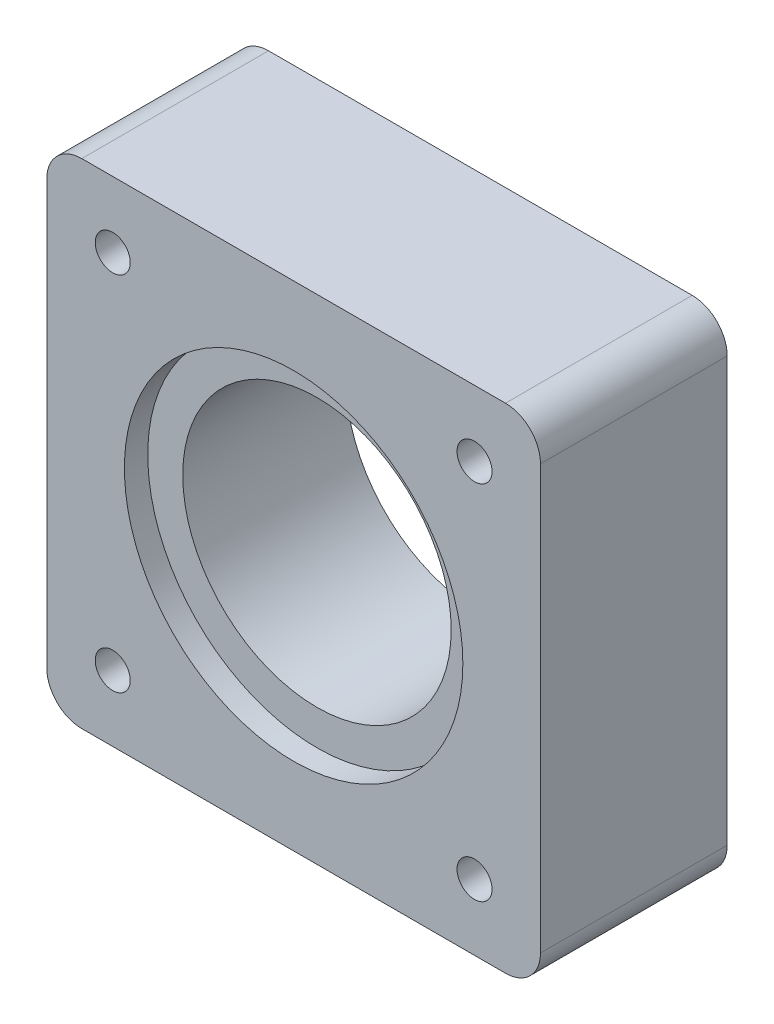
ISO-10303-21;
HEADER;
FILE_DESCRIPTION(('STEP AP214'),'2;1');
FILE_NAME('part.step','',(''),(''),'','','');
FILE_SCHEMA(('AUTOMOTIVE_DESIGN { 1 0 10303 214 1 1 1 1 }'));
ENDSEC;
DATA;
#1=APPLICATION_CONTEXT('core data for automotive mechanical design processes');
#2=APPLICATION_PROTOCOL_DEFINITION('international standard','automotive_design',2000,#1);
#3=PRODUCT_CONTEXT('',#1,'mechanical');
#4=PRODUCT('Part','Part','',(#3));
#5=PRODUCT_RELATED_PRODUCT_CATEGORY('part','',(#4));
#6=PRODUCT_DEFINITION_FORMATION('','',#4);
#7=PRODUCT_DEFINITION_CONTEXT('part definition',#1,'design');
#8=PRODUCT_DEFINITION('design','',#6,#7);
#9=PRODUCT_DEFINITION_SHAPE('','',#8);
#10=(LENGTH_UNIT() NAMED_UNIT(*) SI_UNIT(.MILLI.,.METRE.));
#11=(NAMED_UNIT(*) PLANE_ANGLE_UNIT() SI_UNIT($,.RADIAN.));
#12=(NAMED_UNIT(*) SI_UNIT($,.STERADIAN.) SOLID_ANGLE_UNIT());
#13=UNCERTAINTY_MEASURE_WITH_UNIT(LENGTH_MEASURE(1.E-05),#10,'distance_accuracy_value','');
#14=(GEOMETRIC_REPRESENTATION_CONTEXT(3) GLOBAL_UNCERTAINTY_ASSIGNED_CONTEXT((#13)) GLOBAL_UNIT_ASSIGNED_CONTEXT((#10,
#11,#12)) REPRESENTATION_CONTEXT('',''));
#15=CARTESIAN_POINT('',(0.,0.,0.));
#16=DIRECTION('',(0.,0.,1.));
#17=DIRECTION('',(1.,0.,0.));
#18=AXIS2_PLACEMENT_3D('',#15,#16,#17);
#19=CARTESIAN_POINT('',(21.15,21.15,16.));
#20=DIRECTION('',(0.,0.,-1.));
#21=DIRECTION('',(-1.,0.,0.));
#22=AXIS2_PLACEMENT_3D('',#19,#20,#21);
#23=CYLINDRICAL_SURFACE('',#22,11.5);
#24=CARTESIAN_POINT('',(21.15,21.15,0.));
#25=DIRECTION('',(0.,0.,1.));
#26=DIRECTION('',(1.,0.,0.));
#27=AXIS2_PLACEMENT_3D('',#24,#25,#26);
#28=CIRCLE('',#27,11.5);
#29=CARTESIAN_POINT('',(32.65,21.15,0.));
#30=VERTEX_POINT('',#29);
#31=EDGE_CURVE('E166',#30,#30,#28,.T.);
#32=ORIENTED_EDGE('',*,*,#31,.F.);
#33=EDGE_LOOP('',(#32));
#34=FACE_BOUND('',#33,.T.);
#35=CARTESIAN_POINT('',(21.15,21.15,14.));
#36=DIRECTION('',(0.,0.,1.));
#37=DIRECTION('',(1.,0.,0.));
#38=AXIS2_PLACEMENT_3D('',#35,#36,#37);
#39=CIRCLE('',#38,11.5);
#40=CARTESIAN_POINT('',(32.65,21.15,14.));
#41=VERTEX_POINT('',#40);
#42=EDGE_CURVE('E37',#41,#41,#39,.T.);
#43=ORIENTED_EDGE('',*,*,#42,.T.);
#44=EDGE_LOOP('',(#43));
#45=FACE_BOUND('',#44,.T.);
#46=ADVANCED_FACE('F33',(#34,#45),#23,.F.);
#47=CARTESIAN_POINT('',(0.,0.,16.));
#48=DIRECTION('',(1.,0.,0.));
#49=DIRECTION('',(0.,0.,-1.));
#50=AXIS2_PLACEMENT_3D('',#47,#48,#49);
#51=PLANE('',#50);
#52=DIRECTION('',(0.,-1.,0.));
#53=VECTOR('',#52,1.);
#54=CARTESIAN_POINT('',(0.,0.,0.));
#55=LINE('',#54,#53);
#56=CARTESIAN_POINT('',(0.,39.3,0.));
#57=VERTEX_POINT('',#56);
#58=CARTESIAN_POINT('',(0.,3.,0.));
#59=VERTEX_POINT('',#58);
#60=EDGE_CURVE('E116',#57,#59,#55,.T.);
#61=ORIENTED_EDGE('',*,*,#60,.T.);
#62=DIRECTION('',(0.,0.,-1.));
#63=VECTOR('',#62,1.);
#64=CARTESIAN_POINT('',(0.,3.,16.));
#65=LINE('',#64,#63);
#66=CARTESIAN_POINT('',(0.,3.,16.));
#67=VERTEX_POINT('',#66);
#68=EDGE_CURVE('E11',#59,#67,#65,.F.);
#69=ORIENTED_EDGE('',*,*,#68,.T.);
#70=DIRECTION('',(0.,-1.,0.));
#71=VECTOR('',#70,1.);
#72=CARTESIAN_POINT('',(0.,0.,16.));
#73=LINE('',#72,#71);
#74=CARTESIAN_POINT('',(0.,39.3,16.));
#75=VERTEX_POINT('',#74);
#76=EDGE_CURVE('E117',#75,#67,#73,.T.);
#77=ORIENTED_EDGE('',*,*,#76,.F.);
#78=DIRECTION('',(0.,0.,-1.));
#79=VECTOR('',#78,1.);
#80=CARTESIAN_POINT('',(0.,39.3,16.));
#81=LINE('',#80,#79);
#82=EDGE_CURVE('E106',#75,#57,#81,.T.);
#83=ORIENTED_EDGE('',*,*,#82,.T.);
#84=EDGE_LOOP('',(#61,#69,#77,#83));
#85=FACE_BOUND('',#84,.T.);
#86=ADVANCED_FACE('F115',(#85),#51,.F.);
#87=CARTESIAN_POINT('',(0.,0.,16.));
#88=DIRECTION('',(0.,1.,0.));
#89=DIRECTION('',(0.,0.,1.));
#90=AXIS2_PLACEMENT_3D('',#87,#88,#89);
#91=PLANE('',#90);
#92=DIRECTION('',(1.,0.,0.));
#93=VECTOR('',#92,1.);
#94=CARTESIAN_POINT('',(0.,0.,0.));
#95=LINE('',#94,#93);
#96=CARTESIAN_POINT('',(3.,0.,0.));
#97=VERTEX_POINT('',#96);
#98=CARTESIAN_POINT('',(39.3,0.,0.));
#99=VERTEX_POINT('',#98);
#100=EDGE_CURVE('E124',#97,#99,#95,.T.);
#101=ORIENTED_EDGE('',*,*,#100,.T.);
#102=DIRECTION('',(0.,0.,-1.));
#103=VECTOR('',#102,1.);
#104=CARTESIAN_POINT('',(39.3,0.,16.));
#105=LINE('',#104,#103);
#106=CARTESIAN_POINT('',(39.3,0.,16.));
#107=VERTEX_POINT('',#106);
#108=EDGE_CURVE('E56',#99,#107,#105,.F.);
#109=ORIENTED_EDGE('',*,*,#108,.T.);
#110=DIRECTION('',(1.,0.,0.));
#111=VECTOR('',#110,1.);
#112=CARTESIAN_POINT('',(0.,0.,16.));
#113=LINE('',#112,#111);
#114=CARTESIAN_POINT('',(3.,0.,16.));
#115=VERTEX_POINT('',#114);
#116=EDGE_CURVE('E198',#115,#107,#113,.T.);
#117=ORIENTED_EDGE('',*,*,#116,.F.);
#118=DIRECTION('',(0.,0.,-1.));
#119=VECTOR('',#118,1.);
#120=CARTESIAN_POINT('',(3.,0.,16.));
#121=LINE('',#120,#119);
#122=EDGE_CURVE('E156',#115,#97,#121,.T.);
#123=ORIENTED_EDGE('',*,*,#122,.T.);
#124=EDGE_LOOP('',(#101,#109,#117,#123));
#125=FACE_BOUND('',#124,.T.);
#126=ADVANCED_FACE('F220',(#125),#91,.F.);
#127=CARTESIAN_POINT('',(42.3,0.,16.));
#128=DIRECTION('',(-1.,0.,0.));
#129=DIRECTION('',(0.,0.,1.));
#130=AXIS2_PLACEMENT_3D('',#127,#128,#129);
#131=PLANE('',#130);
#132=DIRECTION('',(0.,1.,0.));
#133=VECTOR('',#132,1.);
#134=CARTESIAN_POINT('',(42.3,0.,16.));
#135=LINE('',#134,#133);
#136=CARTESIAN_POINT('',(42.3,3.,16.));
#137=VERTEX_POINT('',#136);
#138=CARTESIAN_POINT('',(42.3,39.3,16.));
#139=VERTEX_POINT('',#138);
#140=EDGE_CURVE('E199',#137,#139,#135,.T.);
#141=ORIENTED_EDGE('',*,*,#140,.F.);
#142=DIRECTION('',(0.,0.,-1.));
#143=VECTOR('',#142,1.);
#144=CARTESIAN_POINT('',(42.3,3.,16.));
#145=LINE('',#144,#143);
#146=CARTESIAN_POINT('',(42.3,3.,0.));
#147=VERTEX_POINT('',#146);
#148=EDGE_CURVE('E150',#137,#147,#145,.T.);
#149=ORIENTED_EDGE('',*,*,#148,.T.);
#150=DIRECTION('',(0.,1.,0.));
#151=VECTOR('',#150,1.);
#152=CARTESIAN_POINT('',(42.3,0.,0.));
#153=LINE('',#152,#151);
#154=CARTESIAN_POINT('',(42.3,39.3,0.));
#155=VERTEX_POINT('',#154);
#156=EDGE_CURVE('E127',#147,#155,#153,.T.);
#157=ORIENTED_EDGE('',*,*,#156,.T.);
#158=DIRECTION('',(0.,0.,-1.));
#159=VECTOR('',#158,1.);
#160=CARTESIAN_POINT('',(42.3,39.3,16.));
#161=LINE('',#160,#159);
#162=EDGE_CURVE('E147',#155,#139,#161,.F.);
#163=ORIENTED_EDGE('',*,*,#162,.T.);
#164=EDGE_LOOP('',(#141,#149,#157,#163));
#165=FACE_BOUND('',#164,.T.);
#166=ADVANCED_FACE('F213',(#165),#131,.F.);
#167=CARTESIAN_POINT('',(0.,42.3,16.));
#168=DIRECTION('',(0.,-1.,0.));
#169=DIRECTION('',(0.,0.,-1.));
#170=AXIS2_PLACEMENT_3D('',#167,#168,#169);
#171=PLANE('',#170);
#172=DIRECTION('',(-1.,0.,0.));
#173=VECTOR('',#172,1.);
#174=CARTESIAN_POINT('',(0.,42.3,0.));
#175=LINE('',#174,#173);
#176=CARTESIAN_POINT('',(39.3,42.3,0.));
#177=VERTEX_POINT('',#176);
#178=CARTESIAN_POINT('',(3.,42.3,0.));
#179=VERTEX_POINT('',#178);
#180=EDGE_CURVE('E136',#177,#179,#175,.T.);
#181=ORIENTED_EDGE('',*,*,#180,.T.);
#182=DIRECTION('',(0.,0.,-1.));
#183=VECTOR('',#182,1.);
#184=CARTESIAN_POINT('',(3.,42.3,16.));
#185=LINE('',#184,#183);
#186=CARTESIAN_POINT('',(3.,42.3,16.));
#187=VERTEX_POINT('',#186);
#188=EDGE_CURVE('E107',#179,#187,#185,.F.);
#189=ORIENTED_EDGE('',*,*,#188,.T.);
#190=DIRECTION('',(-1.,0.,0.));
#191=VECTOR('',#190,1.);
#192=CARTESIAN_POINT('',(0.,42.3,16.));
#193=LINE('',#192,#191);
#194=CARTESIAN_POINT('',(39.3,42.3,16.));
#195=VERTEX_POINT('',#194);
#196=EDGE_CURVE('E118',#195,#187,#193,.T.);
#197=ORIENTED_EDGE('',*,*,#196,.F.);
#198=DIRECTION('',(0.,0.,-1.));
#199=VECTOR('',#198,1.);
#200=CARTESIAN_POINT('',(39.3,42.3,16.));
#201=LINE('',#200,#199);
#202=EDGE_CURVE('E112',#195,#177,#201,.T.);
#203=ORIENTED_EDGE('',*,*,#202,.T.);
#204=EDGE_LOOP('',(#181,#189,#197,#203));
#205=FACE_BOUND('',#204,.T.);
#206=ADVANCED_FACE('F208',(#205),#171,.F.);
#207=CARTESIAN_POINT('',(0.,0.,16.));
#208=DIRECTION('',(0.,0.,-1.));
#209=DIRECTION('',(-1.,0.,0.));
#210=AXIS2_PLACEMENT_3D('',#207,#208,#209);
#211=PLANE('',#210);
#212=CARTESIAN_POINT('',(21.15,21.15,16.));
#213=DIRECTION('',(0.,0.,1.));
#214=DIRECTION('',(1.,0.,0.));
#215=AXIS2_PLACEMENT_3D('',#212,#213,#214);
#216=CIRCLE('',#215,14.5);
#217=CARTESIAN_POINT('',(35.65,21.15,16.));
#218=VERTEX_POINT('',#217);
#219=EDGE_CURVE('E475',#218,#218,#216,.T.);
#220=ORIENTED_EDGE('',*,*,#219,.F.);
#221=EDGE_LOOP('',(#220));
#222=FACE_BOUND('',#221,.T.);
#223=CARTESIAN_POINT('',(5.65,36.65,16.));
#224=DIRECTION('',(0.,0.,1.));
#225=DIRECTION('',(1.,0.,0.));
#226=AXIS2_PLACEMENT_3D('',#223,#224,#225);
#227=CIRCLE('',#226,1.5);
#228=CARTESIAN_POINT('',(7.15,36.65,16.));
#229=VERTEX_POINT('',#228);
#230=EDGE_CURVE('E130',#229,#229,#227,.T.);
#231=ORIENTED_EDGE('',*,*,#230,.F.);
#232=EDGE_LOOP('',(#231));
#233=FACE_BOUND('',#232,.T.);
#234=CARTESIAN_POINT('',(5.65,5.65,16.));
#235=DIRECTION('',(0.,0.,1.));
#236=DIRECTION('',(1.,0.,0.));
#237=AXIS2_PLACEMENT_3D('',#234,#235,#236);
#238=CIRCLE('',#237,1.5);
#239=CARTESIAN_POINT('',(7.15,5.65,16.));
#240=VERTEX_POINT('',#239);
#241=EDGE_CURVE('E192',#240,#240,#238,.T.);
#242=ORIENTED_EDGE('',*,*,#241,.F.);
#243=EDGE_LOOP('',(#242));
#244=FACE_BOUND('',#243,.T.);
#245=CARTESIAN_POINT('',(36.65,5.65,16.));
#246=DIRECTION('',(0.,0.,1.));
#247=DIRECTION('',(1.,0.,0.));
#248=AXIS2_PLACEMENT_3D('',#245,#246,#247);
#249=CIRCLE('',#248,1.5);
#250=CARTESIAN_POINT('',(38.15,5.65,16.));
#251=VERTEX_POINT('',#250);
#252=EDGE_CURVE('E189',#251,#251,#249,.T.);
#253=ORIENTED_EDGE('',*,*,#252,.F.);
#254=EDGE_LOOP('',(#253));
#255=FACE_BOUND('',#254,.T.);
#256=CARTESIAN_POINT('',(36.65,36.65,16.));
#257=DIRECTION('',(0.,0.,1.));
#258=DIRECTION('',(1.,0.,0.));
#259=AXIS2_PLACEMENT_3D('',#256,#257,#258);
#260=CIRCLE('',#259,1.5);
#261=CARTESIAN_POINT('',(38.15,36.65,16.));
#262=VERTEX_POINT('',#261);
#263=EDGE_CURVE('E125',#262,#262,#260,.T.);
#264=ORIENTED_EDGE('',*,*,#263,.F.);
#265=EDGE_LOOP('',(#264));
#266=FACE_BOUND('',#265,.T.);
#267=ORIENTED_EDGE('',*,*,#116,.T.);
#268=CARTESIAN_POINT('',(39.3,3.,16.));
#269=DIRECTION('',(0.,0.,-1.));
#270=DIRECTION('',(-1.,0.,0.));
#271=AXIS2_PLACEMENT_3D('',#268,#269,#270);
#272=CIRCLE('',#271,3.);
#273=EDGE_CURVE('E42',#107,#137,#272,.F.);
#274=ORIENTED_EDGE('',*,*,#273,.T.);
#275=ORIENTED_EDGE('',*,*,#140,.T.);
#276=CARTESIAN_POINT('',(39.3,39.3,16.));
#277=DIRECTION('',(0.,0.,-1.));
#278=DIRECTION('',(-1.,0.,0.));
#279=AXIS2_PLACEMENT_3D('',#276,#277,#278);
#280=CIRCLE('',#279,3.);
#281=EDGE_CURVE('E143',#139,#195,#280,.F.);
#282=ORIENTED_EDGE('',*,*,#281,.T.);
#283=ORIENTED_EDGE('',*,*,#196,.T.);
#284=CARTESIAN_POINT('',(3.,39.3,16.));
#285=DIRECTION('',(0.,0.,-1.));
#286=DIRECTION('',(-1.,0.,0.));
#287=AXIS2_PLACEMENT_3D('',#284,#285,#286);
#288=CIRCLE('',#287,3.);
#289=EDGE_CURVE('E145',#187,#75,#288,.F.);
#290=ORIENTED_EDGE('',*,*,#289,.T.);
#291=ORIENTED_EDGE('',*,*,#76,.T.);
#292=CARTESIAN_POINT('',(3.,3.,16.));
#293=DIRECTION('',(0.,0.,-1.));
#294=DIRECTION('',(-1.,0.,0.));
#295=AXIS2_PLACEMENT_3D('',#292,#293,#294);
#296=CIRCLE('',#295,3.);
#297=EDGE_CURVE('E160',#67,#115,#296,.F.);
#298=ORIENTED_EDGE('',*,*,#297,.T.);
#299=EDGE_LOOP('',(#267,#274,#275,#282,#283,#290,#291,#298));
#300=FACE_BOUND('',#299,.T.);
#301=ADVANCED_FACE('F204',(#222,#233,#244,#255,#266,#300),#211,.F.);
#302=CARTESIAN_POINT('',(0.,0.,0.));
#303=DIRECTION('',(0.,0.,-1.));
#304=DIRECTION('',(-1.,0.,0.));
#305=AXIS2_PLACEMENT_3D('',#302,#303,#304);
#306=PLANE('',#305);
#307=CARTESIAN_POINT('',(13.,6.5,0.));
#308=DIRECTION('',(0.,0.,1.));
#309=DIRECTION('',(1.,0.,0.));
#310=AXIS2_PLACEMENT_3D('',#307,#308,#309);
#311=CIRCLE('',#310,4.25);
#312=CARTESIAN_POINT('',(17.25,6.5,0.));
#313=VERTEX_POINT('',#312);
#314=EDGE_CURVE('E477',#313,#313,#311,.T.);
#315=ORIENTED_EDGE('',*,*,#314,.T.);
#316=EDGE_LOOP('',(#315));
#317=FACE_BOUND('',#316,.T.);
#318=CARTESIAN_POINT('',(29.3,6.5,0.));
#319=DIRECTION('',(0.,0.,1.));
#320=DIRECTION('',(1.,0.,0.));
#321=AXIS2_PLACEMENT_3D('',#318,#319,#320);
#322=CIRCLE('',#321,4.25);
#323=CARTESIAN_POINT('',(33.55,6.5,0.));
#324=VERTEX_POINT('',#323);
#325=EDGE_CURVE('E484',#324,#324,#322,.T.);
#326=ORIENTED_EDGE('',*,*,#325,.T.);
#327=EDGE_LOOP('',(#326));
#328=FACE_BOUND('',#327,.T.);
#329=CARTESIAN_POINT('',(5.65,36.65,0.));
#330=DIRECTION('',(0.,0.,1.));
#331=DIRECTION('',(1.,0.,0.));
#332=AXIS2_PLACEMENT_3D('',#329,#330,#331);
#333=CIRCLE('',#332,2.85);
#334=CARTESIAN_POINT('',(8.5,36.65,0.));
#335=VERTEX_POINT('',#334);
#336=EDGE_CURVE('E495',#335,#335,#333,.T.);
#337=ORIENTED_EDGE('',*,*,#336,.T.);
#338=EDGE_LOOP('',(#337));
#339=FACE_BOUND('',#338,.T.);
#340=CARTESIAN_POINT('',(5.65,5.65,0.));
#341=DIRECTION('',(0.,0.,1.));
#342=DIRECTION('',(1.,0.,0.));
#343=AXIS2_PLACEMENT_3D('',#340,#341,#342);
#344=CIRCLE('',#343,2.85);
#345=CARTESIAN_POINT('',(8.5,5.65,0.));
#346=VERTEX_POINT('',#345);
#347=EDGE_CURVE('E501',#346,#346,#344,.T.);
#348=ORIENTED_EDGE('',*,*,#347,.T.);
#349=EDGE_LOOP('',(#348));
#350=FACE_BOUND('',#349,.T.);
#351=CARTESIAN_POINT('',(36.65,5.65,0.));
#352=DIRECTION('',(0.,0.,1.));
#353=DIRECTION('',(1.,0.,0.));
#354=AXIS2_PLACEMENT_3D('',#351,#352,#353);
#355=CIRCLE('',#354,2.85);
#356=CARTESIAN_POINT('',(39.5,5.65,0.));
#357=VERTEX_POINT('',#356);
#358=EDGE_CURVE('E490',#357,#357,#355,.T.);
#359=ORIENTED_EDGE('',*,*,#358,.T.);
#360=EDGE_LOOP('',(#359));
#361=FACE_BOUND('',#360,.T.);
#362=CARTESIAN_POINT('',(36.65,36.65,0.));
#363=DIRECTION('',(0.,0.,1.));
#364=DIRECTION('',(1.,0.,0.));
#365=AXIS2_PLACEMENT_3D('',#362,#363,#364);
#366=CIRCLE('',#365,2.85);
#367=CARTESIAN_POINT('',(39.5,36.65,0.));
#368=VERTEX_POINT('',#367);
#369=EDGE_CURVE('E176',#368,#368,#366,.T.);
#370=ORIENTED_EDGE('',*,*,#369,.T.);
#371=EDGE_LOOP('',(#370));
#372=FACE_BOUND('',#371,.T.);
#373=ORIENTED_EDGE('',*,*,#31,.T.);
#374=EDGE_LOOP('',(#373));
#375=FACE_BOUND('',#374,.T.);
#376=ORIENTED_EDGE('',*,*,#156,.F.);
#377=CARTESIAN_POINT('',(39.3,3.,0.));
#378=DIRECTION('',(0.,0.,-1.));
#379=DIRECTION('',(-1.,0.,0.));
#380=AXIS2_PLACEMENT_3D('',#377,#378,#379);
#381=CIRCLE('',#380,3.);
#382=EDGE_CURVE('E154',#147,#99,#381,.T.);
#383=ORIENTED_EDGE('',*,*,#382,.T.);
#384=ORIENTED_EDGE('',*,*,#100,.F.);
#385=CARTESIAN_POINT('',(3.,3.,0.));
#386=DIRECTION('',(0.,0.,-1.));
#387=DIRECTION('',(-1.,0.,0.));
#388=AXIS2_PLACEMENT_3D('',#385,#386,#387);
#389=CIRCLE('',#388,3.);
#390=EDGE_CURVE('E123',#97,#59,#389,.T.);
#391=ORIENTED_EDGE('',*,*,#390,.T.);
#392=ORIENTED_EDGE('',*,*,#60,.F.);
#393=CARTESIAN_POINT('',(3.,39.3,0.));
#394=DIRECTION('',(0.,0.,-1.));
#395=DIRECTION('',(-1.,0.,0.));
#396=AXIS2_PLACEMENT_3D('',#393,#394,#395);
#397=CIRCLE('',#396,3.);
#398=EDGE_CURVE('E102',#57,#179,#397,.T.);
#399=ORIENTED_EDGE('',*,*,#398,.T.);
#400=ORIENTED_EDGE('',*,*,#180,.F.);
#401=CARTESIAN_POINT('',(39.3,39.3,0.));
#402=DIRECTION('',(0.,0.,-1.));
#403=DIRECTION('',(-1.,0.,0.));
#404=AXIS2_PLACEMENT_3D('',#401,#402,#403);
#405=CIRCLE('',#404,3.);
#406=EDGE_CURVE('E113',#177,#155,#405,.T.);
#407=ORIENTED_EDGE('',*,*,#406,.T.);
#408=EDGE_LOOP('',(#376,#383,#384,#391,#392,#399,#400,#407));
#409=FACE_BOUND('',#408,.T.);
#410=ADVANCED_FACE('F121',(#317,#328,#339,#350,#361,#372,#375,#409),#306,.T.);
#411=CARTESIAN_POINT('',(36.65,36.65,16.));
#412=DIRECTION('',(0.,0.,-1.));
#413=DIRECTION('',(-1.,0.,0.));
#414=AXIS2_PLACEMENT_3D('',#411,#412,#413);
#415=CYLINDRICAL_SURFACE('',#414,1.5);
#416=CARTESIAN_POINT('',(36.65,36.65,10.));
#417=DIRECTION('',(0.,0.,1.));
#418=DIRECTION('',(1.,0.,0.));
#419=AXIS2_PLACEMENT_3D('',#416,#417,#418);
#420=CIRCLE('',#419,1.5);
#421=CARTESIAN_POINT('',(38.15,36.65,10.));
#422=VERTEX_POINT('',#421);
#423=EDGE_CURVE('E163',#422,#422,#420,.T.);
#424=ORIENTED_EDGE('',*,*,#423,.F.);
#425=EDGE_LOOP('',(#424));
#426=FACE_BOUND('',#425,.T.);
#427=ORIENTED_EDGE('',*,*,#263,.T.);
#428=EDGE_LOOP('',(#427));
#429=FACE_BOUND('',#428,.T.);
#430=ADVANCED_FACE('F253',(#426,#429),#415,.F.);
#431=CARTESIAN_POINT('',(36.65,5.65,16.));
#432=DIRECTION('',(0.,0.,-1.));
#433=DIRECTION('',(-1.,0.,0.));
#434=AXIS2_PLACEMENT_3D('',#431,#432,#433);
#435=CYLINDRICAL_SURFACE('',#434,1.5);
#436=CARTESIAN_POINT('',(36.65,5.65,10.));
#437=DIRECTION('',(0.,0.,1.));
#438=DIRECTION('',(1.,0.,0.));
#439=AXIS2_PLACEMENT_3D('',#436,#437,#438);
#440=CIRCLE('',#439,1.5);
#441=CARTESIAN_POINT('',(38.15,5.65,10.));
#442=VERTEX_POINT('',#441);
#443=EDGE_CURVE('E174',#442,#442,#440,.T.);
#444=ORIENTED_EDGE('',*,*,#443,.F.);
#445=EDGE_LOOP('',(#444));
#446=FACE_BOUND('',#445,.T.);
#447=ORIENTED_EDGE('',*,*,#252,.T.);
#448=EDGE_LOOP('',(#447));
#449=FACE_BOUND('',#448,.T.);
#450=ADVANCED_FACE('F249',(#446,#449),#435,.F.);
#451=CARTESIAN_POINT('',(5.65,5.65,16.));
#452=DIRECTION('',(0.,0.,-1.));
#453=DIRECTION('',(-1.,0.,0.));
#454=AXIS2_PLACEMENT_3D('',#451,#452,#453);
#455=CYLINDRICAL_SURFACE('',#454,1.5);
#456=CARTESIAN_POINT('',(5.65,5.65,10.));
#457=DIRECTION('',(0.,0.,1.));
#458=DIRECTION('',(1.,0.,0.));
#459=AXIS2_PLACEMENT_3D('',#456,#457,#458);
#460=CIRCLE('',#459,1.5);
#461=CARTESIAN_POINT('',(7.15,5.65,10.));
#462=VERTEX_POINT('',#461);
#463=EDGE_CURVE('E171',#462,#462,#460,.T.);
#464=ORIENTED_EDGE('',*,*,#463,.F.);
#465=EDGE_LOOP('',(#464));
#466=FACE_BOUND('',#465,.T.);
#467=ORIENTED_EDGE('',*,*,#241,.T.);
#468=EDGE_LOOP('',(#467));
#469=FACE_BOUND('',#468,.T.);
#470=ADVANCED_FACE('F245',(#466,#469),#455,.F.);
#471=CARTESIAN_POINT('',(5.65,36.65,16.));
#472=DIRECTION('',(0.,0.,-1.));
#473=DIRECTION('',(-1.,0.,0.));
#474=AXIS2_PLACEMENT_3D('',#471,#472,#473);
#475=CYLINDRICAL_SURFACE('',#474,1.5);
#476=CARTESIAN_POINT('',(5.65,36.65,10.));
#477=DIRECTION('',(0.,0.,1.));
#478=DIRECTION('',(1.,0.,0.));
#479=AXIS2_PLACEMENT_3D('',#476,#477,#478);
#480=CIRCLE('',#479,1.5);
#481=CARTESIAN_POINT('',(7.15,36.65,10.));
#482=VERTEX_POINT('',#481);
#483=EDGE_CURVE('E168',#482,#482,#480,.T.);
#484=ORIENTED_EDGE('',*,*,#483,.F.);
#485=EDGE_LOOP('',(#484));
#486=FACE_BOUND('',#485,.T.);
#487=ORIENTED_EDGE('',*,*,#230,.T.);
#488=EDGE_LOOP('',(#487));
#489=FACE_BOUND('',#488,.T.);
#490=ADVANCED_FACE('F242',(#486,#489),#475,.F.);
#491=CARTESIAN_POINT('',(3.,39.3,16.));
#492=DIRECTION('',(0.,0.,-1.));
#493=DIRECTION('',(-1.,0.,0.));
#494=AXIS2_PLACEMENT_3D('',#491,#492,#493);
#495=CYLINDRICAL_SURFACE('',#494,3.);
#496=ORIENTED_EDGE('',*,*,#289,.F.);
#497=ORIENTED_EDGE('',*,*,#188,.F.);
#498=ORIENTED_EDGE('',*,*,#398,.F.);
#499=ORIENTED_EDGE('',*,*,#82,.F.);
#500=EDGE_LOOP('',(#496,#497,#498,#499));
#501=FACE_BOUND('',#500,.T.);
#502=ADVANCED_FACE('F105',(#501),#495,.T.);
#503=CARTESIAN_POINT('',(39.3,39.3,16.));
#504=DIRECTION('',(0.,0.,-1.));
#505=DIRECTION('',(-1.,0.,0.));
#506=AXIS2_PLACEMENT_3D('',#503,#504,#505);
#507=CYLINDRICAL_SURFACE('',#506,3.);
#508=ORIENTED_EDGE('',*,*,#281,.F.);
#509=ORIENTED_EDGE('',*,*,#162,.F.);
#510=ORIENTED_EDGE('',*,*,#406,.F.);
#511=ORIENTED_EDGE('',*,*,#202,.F.);
#512=EDGE_LOOP('',(#508,#509,#510,#511));
#513=FACE_BOUND('',#512,.T.);
#514=ADVANCED_FACE('F210',(#513),#507,.T.);
#515=CARTESIAN_POINT('',(39.3,3.,16.));
#516=DIRECTION('',(0.,0.,-1.));
#517=DIRECTION('',(-1.,0.,0.));
#518=AXIS2_PLACEMENT_3D('',#515,#516,#517);
#519=CYLINDRICAL_SURFACE('',#518,3.);
#520=ORIENTED_EDGE('',*,*,#273,.F.);
#521=ORIENTED_EDGE('',*,*,#108,.F.);
#522=ORIENTED_EDGE('',*,*,#382,.F.);
#523=ORIENTED_EDGE('',*,*,#148,.F.);
#524=EDGE_LOOP('',(#520,#521,#522,#523));
#525=FACE_BOUND('',#524,.T.);
#526=ADVANCED_FACE('F217',(#525),#519,.T.);
#527=CARTESIAN_POINT('',(3.,3.,16.));
#528=DIRECTION('',(0.,0.,-1.));
#529=DIRECTION('',(-1.,0.,0.));
#530=AXIS2_PLACEMENT_3D('',#527,#528,#529);
#531=CYLINDRICAL_SURFACE('',#530,3.);
#532=ORIENTED_EDGE('',*,*,#297,.F.);
#533=ORIENTED_EDGE('',*,*,#68,.F.);
#534=ORIENTED_EDGE('',*,*,#390,.F.);
#535=ORIENTED_EDGE('',*,*,#122,.F.);
#536=EDGE_LOOP('',(#532,#533,#534,#535));
#537=FACE_BOUND('',#536,.T.);
#538=ADVANCED_FACE('F35',(#537),#531,.T.);
#539=CARTESIAN_POINT('',(36.65,36.65,10.));
#540=DIRECTION('',(0.,0.,-1.));
#541=DIRECTION('',(-1.,0.,0.));
#542=AXIS2_PLACEMENT_3D('',#539,#540,#541);
#543=CYLINDRICAL_SURFACE('',#542,2.85);
#544=CARTESIAN_POINT('',(36.65,36.65,10.));
#545=DIRECTION('',(0.,0.,1.));
#546=DIRECTION('',(1.,0.,0.));
#547=AXIS2_PLACEMENT_3D('',#544,#545,#546);
#548=CIRCLE('',#547,2.85);
#549=CARTESIAN_POINT('',(39.5,36.65,10.));
#550=VERTEX_POINT('',#549);
#551=EDGE_CURVE('E167',#550,#550,#548,.T.);
#552=ORIENTED_EDGE('',*,*,#551,.T.);
#553=EDGE_LOOP('',(#552));
#554=FACE_BOUND('',#553,.T.);
#555=ORIENTED_EDGE('',*,*,#369,.F.);
#556=EDGE_LOOP('',(#555));
#557=FACE_BOUND('',#556,.T.);
#558=ADVANCED_FACE('F223',(#554,#557),#543,.F.);
#559=CARTESIAN_POINT('',(36.65,36.65,10.));
#560=DIRECTION('',(0.,0.,1.));
#561=DIRECTION('',(1.,0.,0.));
#562=AXIS2_PLACEMENT_3D('',#559,#560,#561);
#563=PLANE('',#562);
#564=ORIENTED_EDGE('',*,*,#423,.T.);
#565=EDGE_LOOP('',(#564));
#566=FACE_BOUND('',#565,.T.);
#567=ORIENTED_EDGE('',*,*,#551,.F.);
#568=EDGE_LOOP('',(#567));
#569=FACE_BOUND('',#568,.T.);
#570=ADVANCED_FACE('F228',(#566,#569),#563,.F.);
#571=CARTESIAN_POINT('',(5.65,36.65,10.));
#572=DIRECTION('',(0.,0.,-1.));
#573=DIRECTION('',(-1.,0.,0.));
#574=AXIS2_PLACEMENT_3D('',#571,#572,#573);
#575=CYLINDRICAL_SURFACE('',#574,2.85);
#576=CARTESIAN_POINT('',(5.65,36.65,10.));
#577=DIRECTION('',(0.,0.,1.));
#578=DIRECTION('',(1.,0.,0.));
#579=AXIS2_PLACEMENT_3D('',#576,#577,#578);
#580=CIRCLE('',#579,2.85);
#581=CARTESIAN_POINT('',(8.5,36.65,10.));
#582=VERTEX_POINT('',#581);
#583=EDGE_CURVE('E172',#582,#582,#580,.T.);
#584=ORIENTED_EDGE('',*,*,#583,.T.);
#585=EDGE_LOOP('',(#584));
#586=FACE_BOUND('',#585,.T.);
#587=ORIENTED_EDGE('',*,*,#336,.F.);
#588=EDGE_LOOP('',(#587));
#589=FACE_BOUND('',#588,.T.);
#590=ADVANCED_FACE('F331',(#586,#589),#575,.F.);
#591=CARTESIAN_POINT('',(5.65,36.65,10.));
#592=DIRECTION('',(0.,0.,1.));
#593=DIRECTION('',(1.,0.,0.));
#594=AXIS2_PLACEMENT_3D('',#591,#592,#593);
#595=PLANE('',#594);
#596=ORIENTED_EDGE('',*,*,#483,.T.);
#597=EDGE_LOOP('',(#596));
#598=FACE_BOUND('',#597,.T.);
#599=ORIENTED_EDGE('',*,*,#583,.F.);
#600=EDGE_LOOP('',(#599));
#601=FACE_BOUND('',#600,.T.);
#602=ADVANCED_FACE('F340',(#598,#601),#595,.F.);
#603=CARTESIAN_POINT('',(5.65,5.65,10.));
#604=DIRECTION('',(0.,0.,-1.));
#605=DIRECTION('',(-1.,0.,0.));
#606=AXIS2_PLACEMENT_3D('',#603,#604,#605);
#607=CYLINDRICAL_SURFACE('',#606,2.85);
#608=CARTESIAN_POINT('',(5.65,5.65,10.));
#609=DIRECTION('',(0.,0.,1.));
#610=DIRECTION('',(1.,0.,0.));
#611=AXIS2_PLACEMENT_3D('',#608,#609,#610);
#612=CIRCLE('',#611,2.85);
#613=CARTESIAN_POINT('',(8.5,5.65,10.));
#614=VERTEX_POINT('',#613);
#615=EDGE_CURVE('E498',#614,#614,#612,.T.);
#616=ORIENTED_EDGE('',*,*,#615,.T.);
#617=EDGE_LOOP('',(#616));
#618=FACE_BOUND('',#617,.T.);
#619=ORIENTED_EDGE('',*,*,#347,.F.);
#620=EDGE_LOOP('',(#619));
#621=FACE_BOUND('',#620,.T.);
#622=ADVANCED_FACE('F350',(#618,#621),#607,.F.);
#623=CARTESIAN_POINT('',(5.65,5.65,10.));
#624=DIRECTION('',(0.,0.,1.));
#625=DIRECTION('',(1.,0.,0.));
#626=AXIS2_PLACEMENT_3D('',#623,#624,#625);
#627=PLANE('',#626);
#628=ORIENTED_EDGE('',*,*,#463,.T.);
#629=EDGE_LOOP('',(#628));
#630=FACE_BOUND('',#629,.T.);
#631=ORIENTED_EDGE('',*,*,#615,.F.);
#632=EDGE_LOOP('',(#631));
#633=FACE_BOUND('',#632,.T.);
#634=ADVANCED_FACE('F360',(#630,#633),#627,.F.);
#635=CARTESIAN_POINT('',(36.65,5.65,10.));
#636=DIRECTION('',(0.,0.,-1.));
#637=DIRECTION('',(-1.,0.,0.));
#638=AXIS2_PLACEMENT_3D('',#635,#636,#637);
#639=CYLINDRICAL_SURFACE('',#638,2.85);
#640=CARTESIAN_POINT('',(36.65,5.65,10.));
#641=DIRECTION('',(0.,0.,1.));
#642=DIRECTION('',(1.,0.,0.));
#643=AXIS2_PLACEMENT_3D('',#640,#641,#642);
#644=CIRCLE('',#643,2.85);
#645=CARTESIAN_POINT('',(39.5,5.65,10.));
#646=VERTEX_POINT('',#645);
#647=EDGE_CURVE('E504',#646,#646,#644,.T.);
#648=ORIENTED_EDGE('',*,*,#647,.T.);
#649=EDGE_LOOP('',(#648));
#650=FACE_BOUND('',#649,.T.);
#651=ORIENTED_EDGE('',*,*,#358,.F.);
#652=EDGE_LOOP('',(#651));
#653=FACE_BOUND('',#652,.T.);
#654=ADVANCED_FACE('F370',(#650,#653),#639,.F.);
#655=CARTESIAN_POINT('',(36.65,5.65,10.));
#656=DIRECTION('',(0.,0.,1.));
#657=DIRECTION('',(1.,0.,0.));
#658=AXIS2_PLACEMENT_3D('',#655,#656,#657);
#659=PLANE('',#658);
#660=ORIENTED_EDGE('',*,*,#443,.T.);
#661=EDGE_LOOP('',(#660));
#662=FACE_BOUND('',#661,.T.);
#663=ORIENTED_EDGE('',*,*,#647,.F.);
#664=EDGE_LOOP('',(#663));
#665=FACE_BOUND('',#664,.T.);
#666=ADVANCED_FACE('F380',(#662,#665),#659,.F.);
#667=CARTESIAN_POINT('',(29.3,6.5,12.));
#668=DIRECTION('',(0.,0.,-1.));
#669=DIRECTION('',(-1.,0.,0.));
#670=AXIS2_PLACEMENT_3D('',#667,#668,#669);
#671=CYLINDRICAL_SURFACE('',#670,4.25);
#672=CARTESIAN_POINT('',(29.3,6.5,12.));
#673=DIRECTION('',(0.,0.,1.));
#674=DIRECTION('',(1.,0.,0.));
#675=AXIS2_PLACEMENT_3D('',#672,#673,#674);
#676=CIRCLE('',#675,4.25);
#677=CARTESIAN_POINT('',(33.55,6.5,12.));
#678=VERTEX_POINT('',#677);
#679=EDGE_CURVE('E487',#678,#678,#676,.T.);
#680=ORIENTED_EDGE('',*,*,#679,.T.);
#681=EDGE_LOOP('',(#680));
#682=FACE_BOUND('',#681,.T.);
#683=ORIENTED_EDGE('',*,*,#325,.F.);
#684=EDGE_LOOP('',(#683));
#685=FACE_BOUND('',#684,.T.);
#686=ADVANCED_FACE('F390',(#682,#685),#671,.F.);
#687=CARTESIAN_POINT('',(29.3,6.5,12.));
#688=DIRECTION('',(0.,0.,1.));
#689=DIRECTION('',(1.,0.,0.));
#690=AXIS2_PLACEMENT_3D('',#687,#688,#689);
#691=PLANE('',#690);
#692=ORIENTED_EDGE('',*,*,#679,.F.);
#693=EDGE_LOOP('',(#692));
#694=FACE_BOUND('',#693,.T.);
#695=ADVANCED_FACE('F405',(#694),#691,.F.);
#696=CARTESIAN_POINT('',(13.,6.5,12.));
#697=DIRECTION('',(0.,0.,-1.));
#698=DIRECTION('',(-1.,0.,0.));
#699=AXIS2_PLACEMENT_3D('',#696,#697,#698);
#700=CYLINDRICAL_SURFACE('',#699,4.25);
#701=CARTESIAN_POINT('',(13.,6.5,12.));
#702=DIRECTION('',(0.,0.,1.));
#703=DIRECTION('',(1.,0.,0.));
#704=AXIS2_PLACEMENT_3D('',#701,#702,#703);
#705=CIRCLE('',#704,4.25);
#706=CARTESIAN_POINT('',(17.25,6.5,12.));
#707=VERTEX_POINT('',#706);
#708=EDGE_CURVE('E481',#707,#707,#705,.T.);
#709=ORIENTED_EDGE('',*,*,#708,.T.);
#710=EDGE_LOOP('',(#709));
#711=FACE_BOUND('',#710,.T.);
#712=ORIENTED_EDGE('',*,*,#314,.F.);
#713=EDGE_LOOP('',(#712));
#714=FACE_BOUND('',#713,.T.);
#715=ADVANCED_FACE('F415',(#711,#714),#700,.F.);
#716=CARTESIAN_POINT('',(13.,6.5,12.));
#717=DIRECTION('',(0.,0.,1.));
#718=DIRECTION('',(1.,0.,0.));
#719=AXIS2_PLACEMENT_3D('',#716,#717,#718);
#720=PLANE('',#719);
#721=ORIENTED_EDGE('',*,*,#708,.F.);
#722=EDGE_LOOP('',(#721));
#723=FACE_BOUND('',#722,.T.);
#724=ADVANCED_FACE('F425',(#723),#720,.F.);
#725=CARTESIAN_POINT('',(21.15,21.15,14.));
#726=DIRECTION('',(0.,0.,1.));
#727=DIRECTION('',(1.,0.,0.));
#728=AXIS2_PLACEMENT_3D('',#725,#726,#727);
#729=CYLINDRICAL_SURFACE('',#728,14.5);
#730=CARTESIAN_POINT('',(21.15,21.15,14.));
#731=DIRECTION('',(0.,0.,1.));
#732=DIRECTION('',(1.,0.,0.));
#733=AXIS2_PLACEMENT_3D('',#730,#731,#732);
#734=CIRCLE('',#733,14.5);
#735=CARTESIAN_POINT('',(35.65,21.15,14.));
#736=VERTEX_POINT('',#735);
#737=EDGE_CURVE('E474',#736,#736,#734,.T.);
#738=ORIENTED_EDGE('',*,*,#737,.F.);
#739=EDGE_LOOP('',(#738));
#740=FACE_BOUND('',#739,.T.);
#741=ORIENTED_EDGE('',*,*,#219,.T.);
#742=EDGE_LOOP('',(#741));
#743=FACE_BOUND('',#742,.T.);
#744=ADVANCED_FACE('F434',(#740,#743),#729,.F.);
#745=CARTESIAN_POINT('',(21.15,21.15,14.));
#746=DIRECTION('',(0.,0.,1.));
#747=DIRECTION('',(1.,0.,0.));
#748=AXIS2_PLACEMENT_3D('',#745,#746,#747);
#749=PLANE('',#748);
#750=ORIENTED_EDGE('',*,*,#42,.F.);
#751=EDGE_LOOP('',(#750));
#752=FACE_BOUND('',#751,.T.);
#753=ORIENTED_EDGE('',*,*,#737,.T.);
#754=EDGE_LOOP('',(#753));
#755=FACE_BOUND('',#754,.T.);
#756=ADVANCED_FACE('F455',(#752,#755),#749,.T.);
#757=CLOSED_SHELL('',(#46,#86,#126,#166,#206,#301,#410,#430,#450,#470,#490,#502,#514,#526,#538,
#558,#570,#590,#602,#622,#634,#654,#666,#686,#695,#715,#724,#744,#756));
#758=MANIFOLD_SOLID_BREP('B2',#757);
#759=ADVANCED_BREP_SHAPE_REPRESENTATION('',(#18,#758),#14);
#760=SHAPE_DEFINITION_REPRESENTATION(#9,#759);
ENDSEC;
END-ISO-10303-21;
